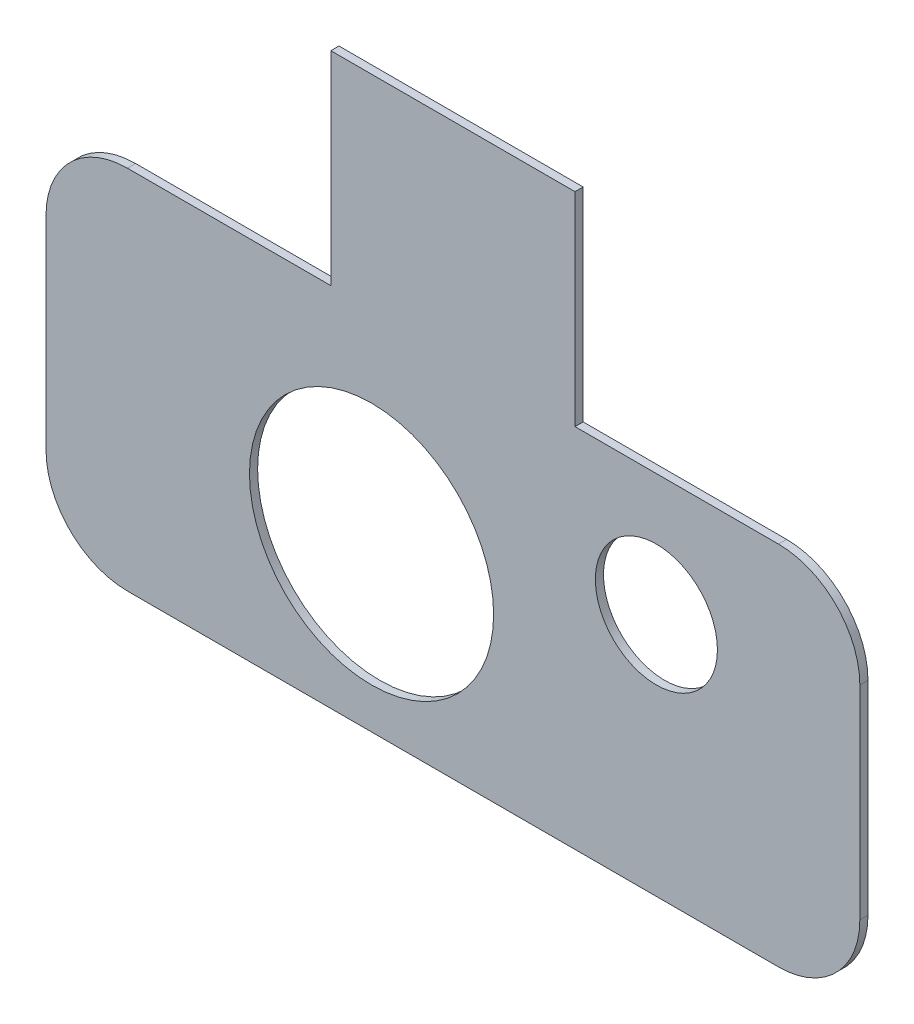
ISO-10303-21;
HEADER;
FILE_DESCRIPTION(('STEP AP214'),'2;1');
FILE_NAME('part.step','',(''),(''),'','','');
FILE_SCHEMA(('AUTOMOTIVE_DESIGN { 1 0 10303 214 1 1 1 1 }'));
ENDSEC;
DATA;
#1=APPLICATION_CONTEXT('core data for automotive mechanical design processes');
#2=APPLICATION_PROTOCOL_DEFINITION('international standard','automotive_design',2000,#1);
#3=PRODUCT_CONTEXT('',#1,'mechanical');
#4=PRODUCT('Part','Part','',(#3));
#5=PRODUCT_RELATED_PRODUCT_CATEGORY('part','',(#4));
#6=PRODUCT_DEFINITION_FORMATION('','',#4);
#7=PRODUCT_DEFINITION_CONTEXT('part definition',#1,'design');
#8=PRODUCT_DEFINITION('design','',#6,#7);
#9=PRODUCT_DEFINITION_SHAPE('','',#8);
#10=(LENGTH_UNIT() NAMED_UNIT(*) SI_UNIT(.MILLI.,.METRE.));
#11=(NAMED_UNIT(*) PLANE_ANGLE_UNIT() SI_UNIT($,.RADIAN.));
#12=(NAMED_UNIT(*) SI_UNIT($,.STERADIAN.) SOLID_ANGLE_UNIT());
#13=UNCERTAINTY_MEASURE_WITH_UNIT(LENGTH_MEASURE(1.E-05),#10,'distance_accuracy_value','');
#14=(GEOMETRIC_REPRESENTATION_CONTEXT(3) GLOBAL_UNCERTAINTY_ASSIGNED_CONTEXT((#13)) GLOBAL_UNIT_ASSIGNED_CONTEXT((#10,
#11,#12)) REPRESENTATION_CONTEXT('',''));
#15=CARTESIAN_POINT('',(0.,0.,0.));
#16=DIRECTION('',(0.,0.,1.));
#17=DIRECTION('',(1.,0.,0.));
#18=AXIS2_PLACEMENT_3D('',#15,#16,#17);
#19=CARTESIAN_POINT('',(-40.7019172294594,-1.83417085427136,1.));
#20=DIRECTION('',(0.,0.,1.));
#21=DIRECTION('',(1.,0.,0.));
#22=AXIS2_PLACEMENT_3D('',#19,#20,#21);
#23=PLANE('',#22);
#24=CARTESIAN_POINT('',(-10.7019172294594,-16.8341708542714,1.));
#25=DIRECTION('',(0.,0.,1.));
#26=DIRECTION('',(1.,0.,0.));
#27=AXIS2_PLACEMENT_3D('',#24,#25,#26);
#28=CIRCLE('',#27,15.);
#29=CARTESIAN_POINT('',(4.29808277054059,-16.8341708542714,1.));
#30=VERTEX_POINT('',#29);
#31=EDGE_CURVE('E163',#30,#30,#28,.T.);
#32=ORIENTED_EDGE('',*,*,#31,.F.);
#33=EDGE_LOOP('',(#32));
#34=FACE_BOUND('',#33,.T.);
#35=DIRECTION('',(-1.,0.,0.));
#36=VECTOR('',#35,1.);
#37=CARTESIAN_POINT('',(-15.7019172294594,8.16582914572864,1.));
#38=LINE('',#37,#36);
#39=CARTESIAN_POINT('',(-15.7019172294594,8.16582914572864,1.));
#40=VERTEX_POINT('',#39);
#41=CARTESIAN_POINT('',(-40.7019172294593,8.16582914572864,1.));
#42=VERTEX_POINT('',#41);
#43=EDGE_CURVE('E183',#40,#42,#38,.T.);
#44=ORIENTED_EDGE('',*,*,#43,.T.);
#45=CARTESIAN_POINT('',(-40.7019172294594,-1.83417085427136,1.));
#46=DIRECTION('',(0.,0.,1.));
#47=DIRECTION('',(1.,0.,0.));
#48=AXIS2_PLACEMENT_3D('',#45,#46,#47);
#49=CIRCLE('',#48,9.99999999999999);
#50=CARTESIAN_POINT('',(-50.7019172294594,-1.83417085427143,1.));
#51=VERTEX_POINT('',#50);
#52=EDGE_CURVE('E112',#42,#51,#49,.T.);
#53=ORIENTED_EDGE('',*,*,#52,.T.);
#54=DIRECTION('',(0.,-1.,0.));
#55=VECTOR('',#54,1.);
#56=CARTESIAN_POINT('',(-50.7019172294594,-1.83417085427143,1.));
#57=LINE('',#56,#55);
#58=CARTESIAN_POINT('',(-50.7019172294594,-26.8341708542713,1.));
#59=VERTEX_POINT('',#58);
#60=EDGE_CURVE('E210',#51,#59,#57,.T.);
#61=ORIENTED_EDGE('',*,*,#60,.T.);
#62=CARTESIAN_POINT('',(-40.7019172294594,-26.8341708542714,1.));
#63=DIRECTION('',(0.,0.,1.));
#64=DIRECTION('',(1.,0.,0.));
#65=AXIS2_PLACEMENT_3D('',#62,#63,#64);
#66=CIRCLE('',#65,10.);
#67=CARTESIAN_POINT('',(-40.7019172294593,-36.8341708542714,1.));
#68=VERTEX_POINT('',#67);
#69=EDGE_CURVE('E227',#59,#68,#66,.T.);
#70=ORIENTED_EDGE('',*,*,#69,.T.);
#71=DIRECTION('',(1.,0.,0.));
#72=VECTOR('',#71,1.);
#73=CARTESIAN_POINT('',(-40.7019172294593,-36.8341708542714,1.));
#74=LINE('',#73,#72);
#75=CARTESIAN_POINT('',(39.2980827705405,-36.8341708542714,1.));
#76=VERTEX_POINT('',#75);
#77=EDGE_CURVE('E226',#68,#76,#74,.T.);
#78=ORIENTED_EDGE('',*,*,#77,.T.);
#79=CARTESIAN_POINT('',(39.2980827705406,-26.8341708542714,1.));
#80=DIRECTION('',(0.,0.,1.));
#81=DIRECTION('',(1.,0.,0.));
#82=AXIS2_PLACEMENT_3D('',#79,#80,#81);
#83=CIRCLE('',#82,10.);
#84=CARTESIAN_POINT('',(49.2980827705406,-26.8341708542713,1.));
#85=VERTEX_POINT('',#84);
#86=EDGE_CURVE('E228',#76,#85,#83,.T.);
#87=ORIENTED_EDGE('',*,*,#86,.T.);
#88=DIRECTION('',(0.,1.,0.));
#89=VECTOR('',#88,1.);
#90=CARTESIAN_POINT('',(49.2980827705406,-1.83417085427143,1.));
#91=LINE('',#90,#89);
#92=CARTESIAN_POINT('',(49.2980827705406,-1.83417085427142,1.));
#93=VERTEX_POINT('',#92);
#94=EDGE_CURVE('E231',#85,#93,#91,.T.);
#95=ORIENTED_EDGE('',*,*,#94,.T.);
#96=CARTESIAN_POINT('',(39.2980827705406,-1.83417085427136,1.));
#97=DIRECTION('',(0.,0.,1.));
#98=DIRECTION('',(-1.,0.,0.));
#99=AXIS2_PLACEMENT_3D('',#96,#97,#98);
#100=CIRCLE('',#99,10.);
#101=CARTESIAN_POINT('',(39.2980827705405,8.16582914572864,1.));
#102=VERTEX_POINT('',#101);
#103=EDGE_CURVE('E240',#93,#102,#100,.T.);
#104=ORIENTED_EDGE('',*,*,#103,.T.);
#105=DIRECTION('',(-1.,0.,0.));
#106=VECTOR('',#105,1.);
#107=CARTESIAN_POINT('',(14.2980827705406,8.16582914572864,1.));
#108=LINE('',#107,#106);
#109=CARTESIAN_POINT('',(14.2980827705406,8.16582914572864,1.));
#110=VERTEX_POINT('',#109);
#111=EDGE_CURVE('E145',#102,#110,#108,.T.);
#112=ORIENTED_EDGE('',*,*,#111,.T.);
#113=DIRECTION('',(0.,1.,0.));
#114=VECTOR('',#113,1.);
#115=CARTESIAN_POINT('',(14.2980827705406,33.1658291457286,1.));
#116=LINE('',#115,#114);
#117=CARTESIAN_POINT('',(14.2980827705406,33.1658291457286,1.));
#118=VERTEX_POINT('',#117);
#119=EDGE_CURVE('E136',#110,#118,#116,.T.);
#120=ORIENTED_EDGE('',*,*,#119,.T.);
#121=DIRECTION('',(-1.,0.,0.));
#122=VECTOR('',#121,1.);
#123=CARTESIAN_POINT('',(-15.7019172294594,33.1658291457286,1.));
#124=LINE('',#123,#122);
#125=CARTESIAN_POINT('',(-15.7019172294594,33.1658291457286,1.));
#126=VERTEX_POINT('',#125);
#127=EDGE_CURVE('E139',#118,#126,#124,.T.);
#128=ORIENTED_EDGE('',*,*,#127,.T.);
#129=DIRECTION('',(0.,-1.,0.));
#130=VECTOR('',#129,1.);
#131=CARTESIAN_POINT('',(-15.7019172294594,8.16582914572864,1.));
#132=LINE('',#131,#130);
#133=EDGE_CURVE('E57',#126,#40,#132,.T.);
#134=ORIENTED_EDGE('',*,*,#133,.T.);
#135=EDGE_LOOP('',(#44,#53,#61,#70,#78,#87,#95,#104,#112,#120,#128,#134));
#136=FACE_BOUND('',#135,.T.);
#137=CARTESIAN_POINT('',(24.2980827705406,-6.83417085427136,1.));
#138=DIRECTION('',(0.,0.,1.));
#139=DIRECTION('',(1.,0.,0.));
#140=AXIS2_PLACEMENT_3D('',#137,#138,#139);
#141=CIRCLE('',#140,7.5);
#142=CARTESIAN_POINT('',(31.7980827705406,-6.83417085427136,1.));
#143=VERTEX_POINT('',#142);
#144=EDGE_CURVE('E278',#143,#143,#141,.T.);
#145=ORIENTED_EDGE('',*,*,#144,.F.);
#146=EDGE_LOOP('',(#145));
#147=FACE_BOUND('',#146,.T.);
#148=ADVANCED_FACE('F39',(#34,#136,#147),#23,.T.);
#149=CARTESIAN_POINT('',(-40.7019172294594,-1.83417085427136,0.));
#150=DIRECTION('',(0.,0.,1.));
#151=DIRECTION('',(1.,0.,0.));
#152=AXIS2_PLACEMENT_3D('',#149,#150,#151);
#153=PLANE('',#152);
#154=DIRECTION('',(-1.,0.,0.));
#155=VECTOR('',#154,1.);
#156=CARTESIAN_POINT('',(-15.7019172294594,8.16582914572864,0.));
#157=LINE('',#156,#155);
#158=CARTESIAN_POINT('',(-15.7019172294594,8.16582914572864,0.));
#159=VERTEX_POINT('',#158);
#160=CARTESIAN_POINT('',(-40.7019172294593,8.16582914572864,0.));
#161=VERTEX_POINT('',#160);
#162=EDGE_CURVE('E158',#159,#161,#157,.T.);
#163=ORIENTED_EDGE('',*,*,#162,.F.);
#164=DIRECTION('',(0.,-1.,0.));
#165=VECTOR('',#164,1.);
#166=CARTESIAN_POINT('',(-15.7019172294594,8.16582914572864,0.));
#167=LINE('',#166,#165);
#168=CARTESIAN_POINT('',(-15.7019172294594,33.1658291457286,0.));
#169=VERTEX_POINT('',#168);
#170=EDGE_CURVE('E104',#169,#159,#167,.T.);
#171=ORIENTED_EDGE('',*,*,#170,.F.);
#172=DIRECTION('',(-1.,0.,0.));
#173=VECTOR('',#172,1.);
#174=CARTESIAN_POINT('',(-15.7019172294594,33.1658291457286,0.));
#175=LINE('',#174,#173);
#176=CARTESIAN_POINT('',(14.2980827705406,33.1658291457286,0.));
#177=VERTEX_POINT('',#176);
#178=EDGE_CURVE('E100',#177,#169,#175,.T.);
#179=ORIENTED_EDGE('',*,*,#178,.F.);
#180=DIRECTION('',(0.,1.,0.));
#181=VECTOR('',#180,1.);
#182=CARTESIAN_POINT('',(14.2980827705406,33.1658291457286,0.));
#183=LINE('',#182,#181);
#184=CARTESIAN_POINT('',(14.2980827705406,8.16582914572864,0.));
#185=VERTEX_POINT('',#184);
#186=EDGE_CURVE('E148',#185,#177,#183,.T.);
#187=ORIENTED_EDGE('',*,*,#186,.F.);
#188=DIRECTION('',(-1.,0.,0.));
#189=VECTOR('',#188,1.);
#190=CARTESIAN_POINT('',(14.2980827705406,8.16582914572864,0.));
#191=LINE('',#190,#189);
#192=CARTESIAN_POINT('',(39.2980827705405,8.16582914572864,0.));
#193=VERTEX_POINT('',#192);
#194=EDGE_CURVE('E178',#193,#185,#191,.T.);
#195=ORIENTED_EDGE('',*,*,#194,.F.);
#196=CARTESIAN_POINT('',(39.2980827705406,-1.83417085427136,0.));
#197=DIRECTION('',(0.,0.,1.));
#198=DIRECTION('',(-1.,0.,0.));
#199=AXIS2_PLACEMENT_3D('',#196,#197,#198);
#200=CIRCLE('',#199,10.);
#201=CARTESIAN_POINT('',(49.2980827705406,-1.83417085427142,0.));
#202=VERTEX_POINT('',#201);
#203=EDGE_CURVE('E176',#202,#193,#200,.T.);
#204=ORIENTED_EDGE('',*,*,#203,.F.);
#205=DIRECTION('',(0.,1.,0.));
#206=VECTOR('',#205,1.);
#207=CARTESIAN_POINT('',(49.2980827705406,-1.83417085427143,0.));
#208=LINE('',#207,#206);
#209=CARTESIAN_POINT('',(49.2980827705406,-26.8341708542713,0.));
#210=VERTEX_POINT('',#209);
#211=EDGE_CURVE('E174',#210,#202,#208,.T.);
#212=ORIENTED_EDGE('',*,*,#211,.F.);
#213=CARTESIAN_POINT('',(39.2980827705406,-26.8341708542714,0.));
#214=DIRECTION('',(0.,0.,1.));
#215=DIRECTION('',(1.,0.,0.));
#216=AXIS2_PLACEMENT_3D('',#213,#214,#215);
#217=CIRCLE('',#216,10.);
#218=CARTESIAN_POINT('',(39.2980827705405,-36.8341708542714,0.));
#219=VERTEX_POINT('',#218);
#220=EDGE_CURVE('E175',#219,#210,#217,.T.);
#221=ORIENTED_EDGE('',*,*,#220,.F.);
#222=DIRECTION('',(1.,0.,0.));
#223=VECTOR('',#222,1.);
#224=CARTESIAN_POINT('',(-40.7019172294593,-36.8341708542714,0.));
#225=LINE('',#224,#223);
#226=CARTESIAN_POINT('',(-40.7019172294593,-36.8341708542714,0.));
#227=VERTEX_POINT('',#226);
#228=EDGE_CURVE('E169',#227,#219,#225,.T.);
#229=ORIENTED_EDGE('',*,*,#228,.F.);
#230=CARTESIAN_POINT('',(-40.7019172294594,-26.8341708542714,0.));
#231=DIRECTION('',(0.,0.,1.));
#232=DIRECTION('',(1.,0.,0.));
#233=AXIS2_PLACEMENT_3D('',#230,#231,#232);
#234=CIRCLE('',#233,10.);
#235=CARTESIAN_POINT('',(-50.7019172294594,-26.8341708542713,0.));
#236=VERTEX_POINT('',#235);
#237=EDGE_CURVE('E166',#236,#227,#234,.T.);
#238=ORIENTED_EDGE('',*,*,#237,.F.);
#239=DIRECTION('',(0.,-1.,0.));
#240=VECTOR('',#239,1.);
#241=CARTESIAN_POINT('',(-50.7019172294594,-1.83417085427143,0.));
#242=LINE('',#241,#240);
#243=CARTESIAN_POINT('',(-50.7019172294594,-1.83417085427143,0.));
#244=VERTEX_POINT('',#243);
#245=EDGE_CURVE('E168',#244,#236,#242,.T.);
#246=ORIENTED_EDGE('',*,*,#245,.F.);
#247=CARTESIAN_POINT('',(-40.7019172294594,-1.83417085427136,0.));
#248=DIRECTION('',(0.,0.,1.));
#249=DIRECTION('',(1.,0.,0.));
#250=AXIS2_PLACEMENT_3D('',#247,#248,#249);
#251=CIRCLE('',#250,9.99999999999999);
#252=EDGE_CURVE('E164',#161,#244,#251,.T.);
#253=ORIENTED_EDGE('',*,*,#252,.F.);
#254=EDGE_LOOP('',(#163,#171,#179,#187,#195,#204,#212,#221,#229,#238,#246,#253));
#255=FACE_BOUND('',#254,.T.);
#256=CARTESIAN_POINT('',(-10.7019172294594,-16.8341708542714,0.));
#257=DIRECTION('',(0.,0.,1.));
#258=DIRECTION('',(1.,0.,0.));
#259=AXIS2_PLACEMENT_3D('',#256,#257,#258);
#260=CIRCLE('',#259,15.);
#261=CARTESIAN_POINT('',(4.29808277054059,-16.8341708542714,0.));
#262=VERTEX_POINT('',#261);
#263=EDGE_CURVE('E283',#262,#262,#260,.T.);
#264=ORIENTED_EDGE('',*,*,#263,.T.);
#265=EDGE_LOOP('',(#264));
#266=FACE_BOUND('',#265,.T.);
#267=CARTESIAN_POINT('',(24.2980827705406,-6.83417085427136,0.));
#268=DIRECTION('',(0.,0.,1.));
#269=DIRECTION('',(1.,0.,0.));
#270=AXIS2_PLACEMENT_3D('',#267,#268,#269);
#271=CIRCLE('',#270,7.5);
#272=CARTESIAN_POINT('',(31.7980827705406,-6.83417085427136,0.));
#273=VERTEX_POINT('',#272);
#274=EDGE_CURVE('E285',#273,#273,#271,.T.);
#275=ORIENTED_EDGE('',*,*,#274,.T.);
#276=EDGE_LOOP('',(#275));
#277=FACE_BOUND('',#276,.T.);
#278=ADVANCED_FACE('F215',(#255,#266,#277),#153,.F.);
#279=CARTESIAN_POINT('',(-15.7019172294594,8.16582914572864,1.));
#280=DIRECTION('',(0.,-1.,0.));
#281=DIRECTION('',(1.,0.,0.));
#282=AXIS2_PLACEMENT_3D('',#279,#280,#281);
#283=PLANE('',#282);
#284=ORIENTED_EDGE('',*,*,#162,.T.);
#285=DIRECTION('',(0.,0.,-1.));
#286=VECTOR('',#285,1.);
#287=CARTESIAN_POINT('',(-40.7019172294593,8.16582914572864,1.));
#288=LINE('',#287,#286);
#289=EDGE_CURVE('E11',#42,#161,#288,.T.);
#290=ORIENTED_EDGE('',*,*,#289,.F.);
#291=ORIENTED_EDGE('',*,*,#43,.F.);
#292=DIRECTION('',(0.,0.,-1.));
#293=VECTOR('',#292,1.);
#294=CARTESIAN_POINT('',(-15.7019172294594,8.16582914572864,1.));
#295=LINE('',#294,#293);
#296=EDGE_CURVE('E157',#40,#159,#295,.T.);
#297=ORIENTED_EDGE('',*,*,#296,.T.);
#298=EDGE_LOOP('',(#284,#290,#291,#297));
#299=FACE_BOUND('',#298,.T.);
#300=ADVANCED_FACE('F41',(#299),#283,.F.);
#301=CARTESIAN_POINT('',(-40.7019172294594,-1.83417085427136,1.));
#302=DIRECTION('',(0.,0.,-1.));
#303=DIRECTION('',(-1.,0.,0.));
#304=AXIS2_PLACEMENT_3D('',#301,#302,#303);
#305=CYLINDRICAL_SURFACE('',#304,9.99999999999999);
#306=ORIENTED_EDGE('',*,*,#252,.T.);
#307=DIRECTION('',(0.,0.,-1.));
#308=VECTOR('',#307,1.);
#309=CARTESIAN_POINT('',(-50.7019172294594,-1.83417085427143,1.));
#310=LINE('',#309,#308);
#311=EDGE_CURVE('E48',#51,#244,#310,.T.);
#312=ORIENTED_EDGE('',*,*,#311,.F.);
#313=ORIENTED_EDGE('',*,*,#52,.F.);
#314=ORIENTED_EDGE('',*,*,#289,.T.);
#315=EDGE_LOOP('',(#306,#312,#313,#314));
#316=FACE_BOUND('',#315,.T.);
#317=ADVANCED_FACE('F380',(#316),#305,.T.);
#318=CARTESIAN_POINT('',(-50.7019172294594,-1.83417085427143,1.));
#319=DIRECTION('',(1.,0.,0.));
#320=DIRECTION('',(0.,1.,0.));
#321=AXIS2_PLACEMENT_3D('',#318,#319,#320);
#322=PLANE('',#321);
#323=ORIENTED_EDGE('',*,*,#245,.T.);
#324=DIRECTION('',(0.,0.,-1.));
#325=VECTOR('',#324,1.);
#326=CARTESIAN_POINT('',(-50.7019172294594,-26.8341708542713,1.));
#327=LINE('',#326,#325);
#328=EDGE_CURVE('E205',#59,#236,#327,.T.);
#329=ORIENTED_EDGE('',*,*,#328,.F.);
#330=ORIENTED_EDGE('',*,*,#60,.F.);
#331=ORIENTED_EDGE('',*,*,#311,.T.);
#332=EDGE_LOOP('',(#323,#329,#330,#331));
#333=FACE_BOUND('',#332,.T.);
#334=ADVANCED_FACE('F209',(#333),#322,.F.);
#335=CARTESIAN_POINT('',(-40.7019172294594,-26.8341708542714,1.));
#336=DIRECTION('',(0.,0.,-1.));
#337=DIRECTION('',(-1.,0.,0.));
#338=AXIS2_PLACEMENT_3D('',#335,#336,#337);
#339=CYLINDRICAL_SURFACE('',#338,10.);
#340=ORIENTED_EDGE('',*,*,#237,.T.);
#341=DIRECTION('',(0.,0.,-1.));
#342=VECTOR('',#341,1.);
#343=CARTESIAN_POINT('',(-40.7019172294593,-36.8341708542714,1.));
#344=LINE('',#343,#342);
#345=EDGE_CURVE('E198',#68,#227,#344,.T.);
#346=ORIENTED_EDGE('',*,*,#345,.F.);
#347=ORIENTED_EDGE('',*,*,#69,.F.);
#348=ORIENTED_EDGE('',*,*,#328,.T.);
#349=EDGE_LOOP('',(#340,#346,#347,#348));
#350=FACE_BOUND('',#349,.T.);
#351=ADVANCED_FACE('F217',(#350),#339,.T.);
#352=CARTESIAN_POINT('',(-40.7019172294593,-36.8341708542714,1.));
#353=DIRECTION('',(0.,1.,0.));
#354=DIRECTION('',(0.,0.,1.));
#355=AXIS2_PLACEMENT_3D('',#352,#353,#354);
#356=PLANE('',#355);
#357=ORIENTED_EDGE('',*,*,#228,.T.);
#358=DIRECTION('',(0.,0.,-1.));
#359=VECTOR('',#358,1.);
#360=CARTESIAN_POINT('',(39.2980827705405,-36.8341708542714,1.));
#361=LINE('',#360,#359);
#362=EDGE_CURVE('E196',#76,#219,#361,.T.);
#363=ORIENTED_EDGE('',*,*,#362,.F.);
#364=ORIENTED_EDGE('',*,*,#77,.F.);
#365=ORIENTED_EDGE('',*,*,#345,.T.);
#366=EDGE_LOOP('',(#357,#363,#364,#365));
#367=FACE_BOUND('',#366,.T.);
#368=ADVANCED_FACE('F222',(#367),#356,.F.);
#369=CARTESIAN_POINT('',(39.2980827705406,-26.8341708542714,1.));
#370=DIRECTION('',(0.,0.,-1.));
#371=DIRECTION('',(-1.,0.,0.));
#372=AXIS2_PLACEMENT_3D('',#369,#370,#371);
#373=CYLINDRICAL_SURFACE('',#372,10.);
#374=ORIENTED_EDGE('',*,*,#220,.T.);
#375=DIRECTION('',(0.,0.,-1.));
#376=VECTOR('',#375,1.);
#377=CARTESIAN_POINT('',(49.2980827705406,-26.8341708542713,1.));
#378=LINE('',#377,#376);
#379=EDGE_CURVE('E194',#85,#210,#378,.T.);
#380=ORIENTED_EDGE('',*,*,#379,.F.);
#381=ORIENTED_EDGE('',*,*,#86,.F.);
#382=ORIENTED_EDGE('',*,*,#362,.T.);
#383=EDGE_LOOP('',(#374,#380,#381,#382));
#384=FACE_BOUND('',#383,.T.);
#385=ADVANCED_FACE('F345',(#384),#373,.T.);
#386=CARTESIAN_POINT('',(49.2980827705406,-1.83417085427143,1.));
#387=DIRECTION('',(-1.,0.,0.));
#388=DIRECTION('',(0.,-1.,0.));
#389=AXIS2_PLACEMENT_3D('',#386,#387,#388);
#390=PLANE('',#389);
#391=ORIENTED_EDGE('',*,*,#211,.T.);
#392=DIRECTION('',(0.,0.,-1.));
#393=VECTOR('',#392,1.);
#394=CARTESIAN_POINT('',(49.2980827705406,-1.83417085427142,1.));
#395=LINE('',#394,#393);
#396=EDGE_CURVE('E189',#93,#202,#395,.T.);
#397=ORIENTED_EDGE('',*,*,#396,.F.);
#398=ORIENTED_EDGE('',*,*,#94,.F.);
#399=ORIENTED_EDGE('',*,*,#379,.T.);
#400=EDGE_LOOP('',(#391,#397,#398,#399));
#401=FACE_BOUND('',#400,.T.);
#402=ADVANCED_FACE('F337',(#401),#390,.F.);
#403=CARTESIAN_POINT('',(39.2980827705406,-1.83417085427136,1.));
#404=DIRECTION('',(0.,0.,-1.));
#405=DIRECTION('',(-1.,0.,0.));
#406=AXIS2_PLACEMENT_3D('',#403,#404,#405);
#407=CYLINDRICAL_SURFACE('',#406,10.);
#408=ORIENTED_EDGE('',*,*,#203,.T.);
#409=DIRECTION('',(0.,0.,-1.));
#410=VECTOR('',#409,1.);
#411=CARTESIAN_POINT('',(39.2980827705405,8.16582914572864,1.));
#412=LINE('',#411,#410);
#413=EDGE_CURVE('E190',#102,#193,#412,.T.);
#414=ORIENTED_EDGE('',*,*,#413,.F.);
#415=ORIENTED_EDGE('',*,*,#103,.F.);
#416=ORIENTED_EDGE('',*,*,#396,.T.);
#417=EDGE_LOOP('',(#408,#414,#415,#416));
#418=FACE_BOUND('',#417,.T.);
#419=ADVANCED_FACE('F244',(#418),#407,.T.);
#420=CARTESIAN_POINT('',(14.2980827705406,8.16582914572864,1.));
#421=DIRECTION('',(0.,-1.,0.));
#422=DIRECTION('',(0.,0.,-1.));
#423=AXIS2_PLACEMENT_3D('',#420,#421,#422);
#424=PLANE('',#423);
#425=ORIENTED_EDGE('',*,*,#194,.T.);
#426=DIRECTION('',(0.,0.,-1.));
#427=VECTOR('',#426,1.);
#428=CARTESIAN_POINT('',(14.2980827705406,8.16582914572864,1.));
#429=LINE('',#428,#427);
#430=EDGE_CURVE('E151',#110,#185,#429,.T.);
#431=ORIENTED_EDGE('',*,*,#430,.F.);
#432=ORIENTED_EDGE('',*,*,#111,.F.);
#433=ORIENTED_EDGE('',*,*,#413,.T.);
#434=EDGE_LOOP('',(#425,#431,#432,#433));
#435=FACE_BOUND('',#434,.T.);
#436=ADVANCED_FACE('F250',(#435),#424,.F.);
#437=CARTESIAN_POINT('',(14.2980827705406,33.1658291457286,1.));
#438=DIRECTION('',(-1.,0.,0.));
#439=DIRECTION('',(0.,-1.,0.));
#440=AXIS2_PLACEMENT_3D('',#437,#438,#439);
#441=PLANE('',#440);
#442=ORIENTED_EDGE('',*,*,#186,.T.);
#443=DIRECTION('',(0.,0.,-1.));
#444=VECTOR('',#443,1.);
#445=CARTESIAN_POINT('',(14.2980827705406,33.1658291457286,1.));
#446=LINE('',#445,#444);
#447=EDGE_CURVE('E150',#118,#177,#446,.T.);
#448=ORIENTED_EDGE('',*,*,#447,.F.);
#449=ORIENTED_EDGE('',*,*,#119,.F.);
#450=ORIENTED_EDGE('',*,*,#430,.T.);
#451=EDGE_LOOP('',(#442,#448,#449,#450));
#452=FACE_BOUND('',#451,.T.);
#453=ADVANCED_FACE('F149',(#452),#441,.F.);
#454=CARTESIAN_POINT('',(-15.7019172294594,33.1658291457286,1.));
#455=DIRECTION('',(0.,-1.,0.));
#456=DIRECTION('',(0.,0.,-1.));
#457=AXIS2_PLACEMENT_3D('',#454,#455,#456);
#458=PLANE('',#457);
#459=ORIENTED_EDGE('',*,*,#178,.T.);
#460=DIRECTION('',(0.,0.,-1.));
#461=VECTOR('',#460,1.);
#462=CARTESIAN_POINT('',(-15.7019172294594,33.1658291457286,1.));
#463=LINE('',#462,#461);
#464=EDGE_CURVE('E152',#126,#169,#463,.T.);
#465=ORIENTED_EDGE('',*,*,#464,.F.);
#466=ORIENTED_EDGE('',*,*,#127,.F.);
#467=ORIENTED_EDGE('',*,*,#447,.T.);
#468=EDGE_LOOP('',(#459,#465,#466,#467));
#469=FACE_BOUND('',#468,.T.);
#470=ADVANCED_FACE('F153',(#469),#458,.F.);
#471=CARTESIAN_POINT('',(-15.7019172294594,8.16582914572864,1.));
#472=DIRECTION('',(1.,0.,0.));
#473=DIRECTION('',(0.,0.,-1.));
#474=AXIS2_PLACEMENT_3D('',#471,#472,#473);
#475=PLANE('',#474);
#476=ORIENTED_EDGE('',*,*,#170,.T.);
#477=ORIENTED_EDGE('',*,*,#296,.F.);
#478=ORIENTED_EDGE('',*,*,#133,.F.);
#479=ORIENTED_EDGE('',*,*,#464,.T.);
#480=EDGE_LOOP('',(#476,#477,#478,#479));
#481=FACE_BOUND('',#480,.T.);
#482=ADVANCED_FACE('F251',(#481),#475,.F.);
#483=CARTESIAN_POINT('',(-10.7019172294594,-16.8341708542714,1.));
#484=DIRECTION('',(0.,0.,-1.));
#485=DIRECTION('',(-1.,0.,0.));
#486=AXIS2_PLACEMENT_3D('',#483,#484,#485);
#487=CYLINDRICAL_SURFACE('',#486,15.);
#488=ORIENTED_EDGE('',*,*,#31,.T.);
#489=EDGE_LOOP('',(#488));
#490=FACE_BOUND('',#489,.T.);
#491=ORIENTED_EDGE('',*,*,#263,.F.);
#492=EDGE_LOOP('',(#491));
#493=FACE_BOUND('',#492,.T.);
#494=ADVANCED_FACE('F254',(#490,#493),#487,.F.);
#495=CARTESIAN_POINT('',(24.2980827705406,-6.83417085427136,1.));
#496=DIRECTION('',(0.,0.,-1.));
#497=DIRECTION('',(-1.,0.,0.));
#498=AXIS2_PLACEMENT_3D('',#495,#496,#497);
#499=CYLINDRICAL_SURFACE('',#498,7.5);
#500=ORIENTED_EDGE('',*,*,#144,.T.);
#501=EDGE_LOOP('',(#500));
#502=FACE_BOUND('',#501,.T.);
#503=ORIENTED_EDGE('',*,*,#274,.F.);
#504=EDGE_LOOP('',(#503));
#505=FACE_BOUND('',#504,.T.);
#506=ADVANCED_FACE('F260',(#502,#505),#499,.F.);
#507=CLOSED_SHELL('',(#148,#278,#300,#317,#334,#351,#368,#385,#402,#419,#436,#453,#470,#482,
#494,#506));
#508=MANIFOLD_SOLID_BREP('B2',#507);
#509=ADVANCED_BREP_SHAPE_REPRESENTATION('',(#18,#508),#14);
#510=SHAPE_DEFINITION_REPRESENTATION(#9,#509);
ENDSEC;
END-ISO-10303-21;
